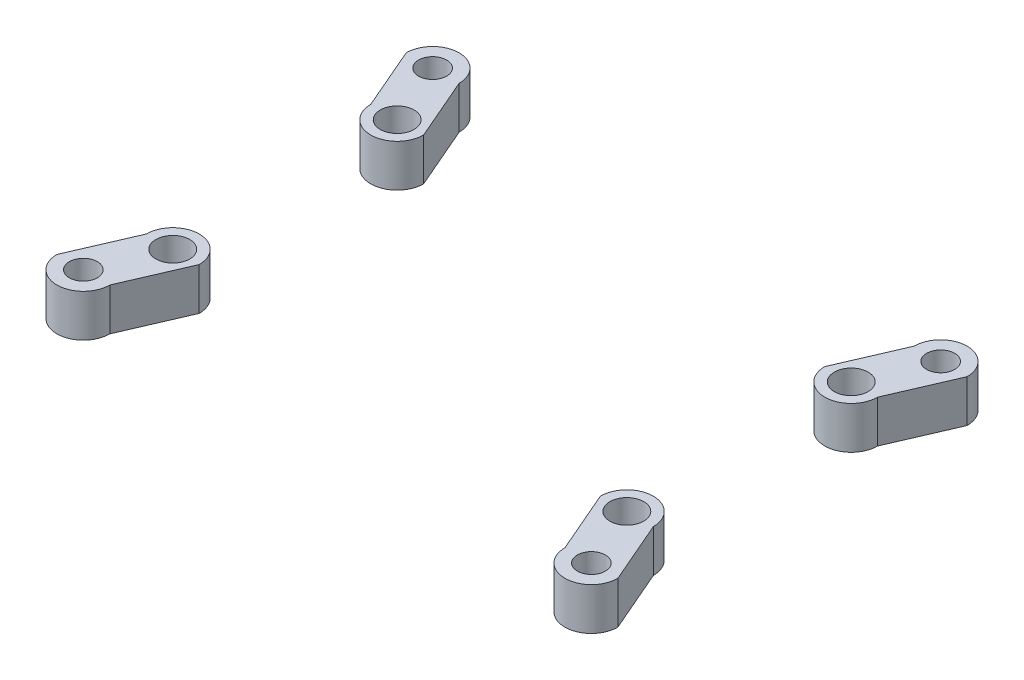
ISO-10303-21;
HEADER;
FILE_DESCRIPTION(('STEP AP214'),'2;1');
FILE_NAME('part.step','',(''),(''),'','','');
FILE_SCHEMA(('AUTOMOTIVE_DESIGN { 1 0 10303 214 1 1 1 1 }'));
ENDSEC;
DATA;
#1=APPLICATION_CONTEXT('core data for automotive mechanical design processes');
#2=APPLICATION_PROTOCOL_DEFINITION('international standard','automotive_design',2000,#1);
#3=PRODUCT_CONTEXT('',#1,'mechanical');
#4=PRODUCT('Part','Part','',(#3));
#5=PRODUCT_RELATED_PRODUCT_CATEGORY('part','',(#4));
#6=PRODUCT_DEFINITION_FORMATION('','',#4);
#7=PRODUCT_DEFINITION_CONTEXT('part definition',#1,'design');
#8=PRODUCT_DEFINITION('design','',#6,#7);
#9=PRODUCT_DEFINITION_SHAPE('','',#8);
#10=(LENGTH_UNIT() NAMED_UNIT(*) SI_UNIT(.MILLI.,.METRE.));
#11=(NAMED_UNIT(*) PLANE_ANGLE_UNIT() SI_UNIT($,.RADIAN.));
#12=(NAMED_UNIT(*) SI_UNIT($,.STERADIAN.) SOLID_ANGLE_UNIT());
#13=UNCERTAINTY_MEASURE_WITH_UNIT(LENGTH_MEASURE(1.E-05),#10,'distance_accuracy_value','');
#14=(GEOMETRIC_REPRESENTATION_CONTEXT(3) GLOBAL_UNCERTAINTY_ASSIGNED_CONTEXT((#13)) GLOBAL_UNIT_ASSIGNED_CONTEXT((#10,
#11,#12)) REPRESENTATION_CONTEXT('',''));
#15=CARTESIAN_POINT('',(0.,0.,0.));
#16=DIRECTION('',(0.,0.,1.));
#17=DIRECTION('',(1.,0.,0.));
#18=AXIS2_PLACEMENT_3D('',#15,#16,#17);
#19=CARTESIAN_POINT('',(-21.45,4.,10.6));
#20=DIRECTION('',(0.,-1.,0.));
#21=DIRECTION('',(0.,0.,-1.));
#22=AXIS2_PLACEMENT_3D('',#19,#20,#21);
#23=CYLINDRICAL_SURFACE('',#22,2.5);
#24=CARTESIAN_POINT('',(-21.45,0.,10.6));
#25=DIRECTION('',(0.,1.,0.));
#26=DIRECTION('',(0.,0.,-1.));
#27=AXIS2_PLACEMENT_3D('',#24,#25,#26);
#28=CIRCLE('',#27,2.5);
#29=CARTESIAN_POINT('',(-18.95,0.,10.6));
#30=VERTEX_POINT('',#29);
#31=CARTESIAN_POINT('',(-23.95,0.,10.6));
#32=VERTEX_POINT('',#31);
#33=EDGE_CURVE('E12',#30,#32,#28,.T.);
#34=ORIENTED_EDGE('',*,*,#33,.T.);
#35=DIRECTION('',(0.,-1.,0.));
#36=VECTOR('',#35,1.);
#37=CARTESIAN_POINT('',(-23.95,4.,10.6));
#38=LINE('',#37,#36);
#39=CARTESIAN_POINT('',(-23.95,4.,10.6));
#40=VERTEX_POINT('',#39);
#41=EDGE_CURVE('E123',#40,#32,#38,.T.);
#42=ORIENTED_EDGE('',*,*,#41,.F.);
#43=CARTESIAN_POINT('',(-21.45,4.,10.6));
#44=DIRECTION('',(0.,1.,0.));
#45=DIRECTION('',(0.,0.,-1.));
#46=AXIS2_PLACEMENT_3D('',#43,#44,#45);
#47=CIRCLE('',#46,2.5);
#48=CARTESIAN_POINT('',(-18.95,4.,10.6));
#49=VERTEX_POINT('',#48);
#50=EDGE_CURVE('E112',#49,#40,#47,.T.);
#51=ORIENTED_EDGE('',*,*,#50,.F.);
#52=DIRECTION('',(0.,-1.,0.));
#53=VECTOR('',#52,1.);
#54=CARTESIAN_POINT('',(-18.95,4.,10.6));
#55=LINE('',#54,#53);
#56=EDGE_CURVE('E109',#49,#30,#55,.T.);
#57=ORIENTED_EDGE('',*,*,#56,.T.);
#58=EDGE_LOOP('',(#34,#42,#51,#57));
#59=FACE_BOUND('',#58,.T.);
#60=ADVANCED_FACE('F50',(#59),#23,.T.);
#61=CARTESIAN_POINT('',(-26.5,4.,16.5));
#62=DIRECTION('',(0.917933613069608,0.,0.396734019208053));
#63=DIRECTION('',(0.396734019208053,0.,-0.917933613069608));
#64=AXIS2_PLACEMENT_3D('',#61,#62,#63);
#65=PLANE('',#64);
#66=DIRECTION('',(-0.396734019208053,0.,0.917933613069608));
#67=VECTOR('',#66,1.);
#68=CARTESIAN_POINT('',(-26.5,0.,16.5));
#69=LINE('',#68,#67);
#70=CARTESIAN_POINT('',(-26.5,0.,16.5));
#71=VERTEX_POINT('',#70);
#72=EDGE_CURVE('E60',#32,#71,#69,.T.);
#73=ORIENTED_EDGE('',*,*,#72,.T.);
#74=DIRECTION('',(0.,-1.,0.));
#75=VECTOR('',#74,1.);
#76=CARTESIAN_POINT('',(-26.5,4.,16.5));
#77=LINE('',#76,#75);
#78=CARTESIAN_POINT('',(-26.5,4.,16.5));
#79=VERTEX_POINT('',#78);
#80=EDGE_CURVE('E105',#79,#71,#77,.T.);
#81=ORIENTED_EDGE('',*,*,#80,.F.);
#82=DIRECTION('',(-0.396734019208053,0.,0.917933613069608));
#83=VECTOR('',#82,1.);
#84=CARTESIAN_POINT('',(-26.5,4.,16.5));
#85=LINE('',#84,#83);
#86=EDGE_CURVE('E84',#40,#79,#85,.T.);
#87=ORIENTED_EDGE('',*,*,#86,.F.);
#88=ORIENTED_EDGE('',*,*,#41,.T.);
#89=EDGE_LOOP('',(#73,#81,#87,#88));
#90=FACE_BOUND('',#89,.T.);
#91=ADVANCED_FACE('F146',(#90),#65,.F.);
#92=CARTESIAN_POINT('',(-24.,4.,16.5));
#93=DIRECTION('',(0.,-1.,0.));
#94=DIRECTION('',(0.,0.,-1.));
#95=AXIS2_PLACEMENT_3D('',#92,#93,#94);
#96=CYLINDRICAL_SURFACE('',#95,2.5);
#97=CARTESIAN_POINT('',(-24.,0.,16.5));
#98=DIRECTION('',(0.,1.,0.));
#99=DIRECTION('',(0.,0.,-1.));
#100=AXIS2_PLACEMENT_3D('',#97,#98,#99);
#101=CIRCLE('',#100,2.5);
#102=CARTESIAN_POINT('',(-21.5,0.,16.5));
#103=VERTEX_POINT('',#102);
#104=EDGE_CURVE('E100',#71,#103,#101,.T.);
#105=ORIENTED_EDGE('',*,*,#104,.T.);
#106=DIRECTION('',(0.,-1.,0.));
#107=VECTOR('',#106,1.);
#108=CARTESIAN_POINT('',(-21.5,4.,16.5));
#109=LINE('',#108,#107);
#110=CARTESIAN_POINT('',(-21.5,4.,16.5));
#111=VERTEX_POINT('',#110);
#112=EDGE_CURVE('E103',#111,#103,#109,.T.);
#113=ORIENTED_EDGE('',*,*,#112,.F.);
#114=CARTESIAN_POINT('',(-24.,4.,16.5));
#115=DIRECTION('',(0.,1.,0.));
#116=DIRECTION('',(0.,0.,-1.));
#117=AXIS2_PLACEMENT_3D('',#114,#115,#116);
#118=CIRCLE('',#117,2.5);
#119=EDGE_CURVE('E119',#79,#111,#118,.T.);
#120=ORIENTED_EDGE('',*,*,#119,.F.);
#121=ORIENTED_EDGE('',*,*,#80,.T.);
#122=EDGE_LOOP('',(#105,#113,#120,#121));
#123=FACE_BOUND('',#122,.T.);
#124=ADVANCED_FACE('F101',(#123),#96,.T.);
#125=CARTESIAN_POINT('',(-21.5,4.,16.5));
#126=DIRECTION('',(-0.917933613069608,0.,-0.396734019208053));
#127=DIRECTION('',(-0.396734019208053,0.,0.917933613069608));
#128=AXIS2_PLACEMENT_3D('',#125,#126,#127);
#129=PLANE('',#128);
#130=DIRECTION('',(0.396734019208053,0.,-0.917933613069608));
#131=VECTOR('',#130,1.);
#132=CARTESIAN_POINT('',(-21.5,0.,16.5));
#133=LINE('',#132,#131);
#134=EDGE_CURVE('E94',#103,#30,#133,.T.);
#135=ORIENTED_EDGE('',*,*,#134,.T.);
#136=ORIENTED_EDGE('',*,*,#56,.F.);
#137=DIRECTION('',(0.396734019208053,0.,-0.917933613069608));
#138=VECTOR('',#137,1.);
#139=CARTESIAN_POINT('',(-21.5,4.,16.5));
#140=LINE('',#139,#138);
#141=EDGE_CURVE('E108',#111,#49,#140,.T.);
#142=ORIENTED_EDGE('',*,*,#141,.F.);
#143=ORIENTED_EDGE('',*,*,#112,.T.);
#144=EDGE_LOOP('',(#135,#136,#142,#143));
#145=FACE_BOUND('',#144,.T.);
#146=ADVANCED_FACE('F107',(#145),#129,.F.);
#147=CARTESIAN_POINT('',(-21.45,4.,10.6));
#148=DIRECTION('',(0.,-1.,0.));
#149=DIRECTION('',(0.,0.,-1.));
#150=AXIS2_PLACEMENT_3D('',#147,#148,#149);
#151=PLANE('',#150);
#152=CARTESIAN_POINT('',(-21.45,4.,10.6));
#153=DIRECTION('',(0.,1.,0.));
#154=DIRECTION('',(0.,0.,1.));
#155=AXIS2_PLACEMENT_3D('',#152,#153,#154);
#156=CIRCLE('',#155,1.6);
#157=CARTESIAN_POINT('',(-21.45,4.,12.2));
#158=VERTEX_POINT('',#157);
#159=EDGE_CURVE('E133',#158,#158,#156,.T.);
#160=ORIENTED_EDGE('',*,*,#159,.F.);
#161=EDGE_LOOP('',(#160));
#162=FACE_BOUND('',#161,.T.);
#163=CARTESIAN_POINT('',(-24.,4.,16.5));
#164=DIRECTION('',(0.,1.,0.));
#165=DIRECTION('',(0.,0.,-1.));
#166=AXIS2_PLACEMENT_3D('',#163,#164,#165);
#167=CIRCLE('',#166,1.325);
#168=CARTESIAN_POINT('',(-24.,4.,15.175));
#169=VERTEX_POINT('',#168);
#170=EDGE_CURVE('E124',#169,#169,#167,.T.);
#171=ORIENTED_EDGE('',*,*,#170,.F.);
#172=EDGE_LOOP('',(#171));
#173=FACE_BOUND('',#172,.T.);
#174=ORIENTED_EDGE('',*,*,#50,.T.);
#175=ORIENTED_EDGE('',*,*,#86,.T.);
#176=ORIENTED_EDGE('',*,*,#119,.T.);
#177=ORIENTED_EDGE('',*,*,#141,.T.);
#178=EDGE_LOOP('',(#174,#175,#176,#177));
#179=FACE_BOUND('',#178,.T.);
#180=ADVANCED_FACE('F52',(#162,#173,#179),#151,.F.);
#181=CARTESIAN_POINT('',(-21.45,0.,10.6));
#182=DIRECTION('',(0.,-1.,0.));
#183=DIRECTION('',(0.,0.,-1.));
#184=AXIS2_PLACEMENT_3D('',#181,#182,#183);
#185=PLANE('',#184);
#186=CARTESIAN_POINT('',(-21.45,0.,10.6));
#187=DIRECTION('',(0.,-1.,0.));
#188=DIRECTION('',(0.,0.,-1.));
#189=AXIS2_PLACEMENT_3D('',#186,#187,#188);
#190=CIRCLE('',#189,1.6);
#191=CARTESIAN_POINT('',(-21.45,0.,9.));
#192=VERTEX_POINT('',#191);
#193=EDGE_CURVE('E54',#192,#192,#190,.F.);
#194=ORIENTED_EDGE('',*,*,#193,.T.);
#195=EDGE_LOOP('',(#194));
#196=FACE_BOUND('',#195,.T.);
#197=CARTESIAN_POINT('',(-24.,0.,16.5));
#198=DIRECTION('',(0.,-1.,0.));
#199=DIRECTION('',(0.,0.,-1.));
#200=AXIS2_PLACEMENT_3D('',#197,#198,#199);
#201=CIRCLE('',#200,1.325);
#202=CARTESIAN_POINT('',(-24.,0.,15.175));
#203=VERTEX_POINT('',#202);
#204=EDGE_CURVE('E121',#203,#203,#201,.F.);
#205=ORIENTED_EDGE('',*,*,#204,.T.);
#206=EDGE_LOOP('',(#205));
#207=FACE_BOUND('',#206,.T.);
#208=ORIENTED_EDGE('',*,*,#33,.F.);
#209=ORIENTED_EDGE('',*,*,#134,.F.);
#210=ORIENTED_EDGE('',*,*,#104,.F.);
#211=ORIENTED_EDGE('',*,*,#72,.F.);
#212=EDGE_LOOP('',(#208,#209,#210,#211));
#213=FACE_BOUND('',#212,.T.);
#214=ADVANCED_FACE('F111',(#196,#207,#213),#185,.T.);
#215=CARTESIAN_POINT('',(-24.,4.,16.5));
#216=DIRECTION('',(0.,-1.,0.));
#217=DIRECTION('',(0.,0.,-1.));
#218=AXIS2_PLACEMENT_3D('',#215,#216,#217);
#219=CYLINDRICAL_SURFACE('',#218,1.325);
#220=ORIENTED_EDGE('',*,*,#204,.F.);
#221=EDGE_LOOP('',(#220));
#222=FACE_BOUND('',#221,.T.);
#223=ORIENTED_EDGE('',*,*,#170,.T.);
#224=EDGE_LOOP('',(#223));
#225=FACE_BOUND('',#224,.T.);
#226=ADVANCED_FACE('F159',(#222,#225),#219,.F.);
#227=CARTESIAN_POINT('',(-21.45,4.,10.6));
#228=DIRECTION('',(0.,-1.,0.));
#229=DIRECTION('',(0.,0.,-1.));
#230=AXIS2_PLACEMENT_3D('',#227,#228,#229);
#231=CYLINDRICAL_SURFACE('',#230,1.6);
#232=ORIENTED_EDGE('',*,*,#193,.F.);
#233=EDGE_LOOP('',(#232));
#234=FACE_BOUND('',#233,.T.);
#235=ORIENTED_EDGE('',*,*,#159,.T.);
#236=EDGE_LOOP('',(#235));
#237=FACE_BOUND('',#236,.T.);
#238=ADVANCED_FACE('F139',(#234,#237),#231,.F.);
#239=CLOSED_SHELL('',(#60,#91,#124,#146,#180,#214,#226,#238));
#240=MANIFOLD_SOLID_BREP('B2',#239);
#241=CARTESIAN_POINT('',(21.45,4.,-10.6));
#242=DIRECTION('',(0.,-1.,0.));
#243=DIRECTION('',(0.,0.,-1.));
#244=AXIS2_PLACEMENT_3D('',#241,#242,#243);
#245=CYLINDRICAL_SURFACE('',#244,2.5);
#246=CARTESIAN_POINT('',(21.45,0.,-10.6));
#247=DIRECTION('',(0.,1.,0.));
#248=DIRECTION('',(0.,0.,-1.));
#249=AXIS2_PLACEMENT_3D('',#246,#247,#248);
#250=CIRCLE('',#249,2.5);
#251=CARTESIAN_POINT('',(18.95,0.,-10.6));
#252=VERTEX_POINT('',#251);
#253=CARTESIAN_POINT('',(23.95,0.,-10.6));
#254=VERTEX_POINT('',#253);
#255=EDGE_CURVE('E48',#252,#254,#250,.T.);
#256=ORIENTED_EDGE('',*,*,#255,.T.);
#257=DIRECTION('',(0.,-1.,0.));
#258=VECTOR('',#257,1.);
#259=CARTESIAN_POINT('',(23.95,4.,-10.6));
#260=LINE('',#259,#258);
#261=CARTESIAN_POINT('',(23.95,4.,-10.6));
#262=VERTEX_POINT('',#261);
#263=EDGE_CURVE('E299',#262,#254,#260,.T.);
#264=ORIENTED_EDGE('',*,*,#263,.F.);
#265=CARTESIAN_POINT('',(21.45,4.,-10.6));
#266=DIRECTION('',(0.,1.,0.));
#267=DIRECTION('',(0.,0.,-1.));
#268=AXIS2_PLACEMENT_3D('',#265,#266,#267);
#269=CIRCLE('',#268,2.5);
#270=CARTESIAN_POINT('',(18.95,4.,-10.6));
#271=VERTEX_POINT('',#270);
#272=EDGE_CURVE('E288',#271,#262,#269,.T.);
#273=ORIENTED_EDGE('',*,*,#272,.F.);
#274=DIRECTION('',(0.,-1.,0.));
#275=VECTOR('',#274,1.);
#276=CARTESIAN_POINT('',(18.95,4.,-10.6));
#277=LINE('',#276,#275);
#278=EDGE_CURVE('E285',#271,#252,#277,.T.);
#279=ORIENTED_EDGE('',*,*,#278,.T.);
#280=EDGE_LOOP('',(#256,#264,#273,#279));
#281=FACE_BOUND('',#280,.T.);
#282=ADVANCED_FACE('F226',(#281),#245,.T.);
#283=CARTESIAN_POINT('',(26.5,4.,-16.5));
#284=DIRECTION('',(-0.917933613069608,0.,-0.396734019208053));
#285=DIRECTION('',(-0.396734019208053,0.,0.917933613069608));
#286=AXIS2_PLACEMENT_3D('',#283,#284,#285);
#287=PLANE('',#286);
#288=DIRECTION('',(0.396734019208053,0.,-0.917933613069608));
#289=VECTOR('',#288,1.);
#290=CARTESIAN_POINT('',(26.5,0.,-16.5));
#291=LINE('',#290,#289);
#292=CARTESIAN_POINT('',(26.5,0.,-16.5));
#293=VERTEX_POINT('',#292);
#294=EDGE_CURVE('E236',#254,#293,#291,.T.);
#295=ORIENTED_EDGE('',*,*,#294,.T.);
#296=DIRECTION('',(0.,-1.,0.));
#297=VECTOR('',#296,1.);
#298=CARTESIAN_POINT('',(26.5,4.,-16.5));
#299=LINE('',#298,#297);
#300=CARTESIAN_POINT('',(26.5,4.,-16.5));
#301=VERTEX_POINT('',#300);
#302=EDGE_CURVE('E281',#301,#293,#299,.T.);
#303=ORIENTED_EDGE('',*,*,#302,.F.);
#304=DIRECTION('',(0.396734019208053,0.,-0.917933613069608));
#305=VECTOR('',#304,1.);
#306=CARTESIAN_POINT('',(26.5,4.,-16.5));
#307=LINE('',#306,#305);
#308=EDGE_CURVE('E260',#262,#301,#307,.T.);
#309=ORIENTED_EDGE('',*,*,#308,.F.);
#310=ORIENTED_EDGE('',*,*,#263,.T.);
#311=EDGE_LOOP('',(#295,#303,#309,#310));
#312=FACE_BOUND('',#311,.T.);
#313=ADVANCED_FACE('F322',(#312),#287,.F.);
#314=CARTESIAN_POINT('',(24.,4.,-16.5));
#315=DIRECTION('',(0.,-1.,0.));
#316=DIRECTION('',(0.,0.,-1.));
#317=AXIS2_PLACEMENT_3D('',#314,#315,#316);
#318=CYLINDRICAL_SURFACE('',#317,2.5);
#319=CARTESIAN_POINT('',(24.,0.,-16.5));
#320=DIRECTION('',(0.,1.,0.));
#321=DIRECTION('',(0.,0.,-1.));
#322=AXIS2_PLACEMENT_3D('',#319,#320,#321);
#323=CIRCLE('',#322,2.5);
#324=CARTESIAN_POINT('',(21.5,0.,-16.5));
#325=VERTEX_POINT('',#324);
#326=EDGE_CURVE('E276',#293,#325,#323,.T.);
#327=ORIENTED_EDGE('',*,*,#326,.T.);
#328=DIRECTION('',(0.,-1.,0.));
#329=VECTOR('',#328,1.);
#330=CARTESIAN_POINT('',(21.5,4.,-16.5));
#331=LINE('',#330,#329);
#332=CARTESIAN_POINT('',(21.5,4.,-16.5));
#333=VERTEX_POINT('',#332);
#334=EDGE_CURVE('E279',#333,#325,#331,.T.);
#335=ORIENTED_EDGE('',*,*,#334,.F.);
#336=CARTESIAN_POINT('',(24.,4.,-16.5));
#337=DIRECTION('',(0.,1.,0.));
#338=DIRECTION('',(0.,0.,-1.));
#339=AXIS2_PLACEMENT_3D('',#336,#337,#338);
#340=CIRCLE('',#339,2.5);
#341=EDGE_CURVE('E295',#301,#333,#340,.T.);
#342=ORIENTED_EDGE('',*,*,#341,.F.);
#343=ORIENTED_EDGE('',*,*,#302,.T.);
#344=EDGE_LOOP('',(#327,#335,#342,#343));
#345=FACE_BOUND('',#344,.T.);
#346=ADVANCED_FACE('F277',(#345),#318,.T.);
#347=CARTESIAN_POINT('',(21.5,4.,-16.5));
#348=DIRECTION('',(0.917933613069608,0.,0.396734019208053));
#349=DIRECTION('',(0.396734019208053,0.,-0.917933613069608));
#350=AXIS2_PLACEMENT_3D('',#347,#348,#349);
#351=PLANE('',#350);
#352=DIRECTION('',(-0.396734019208053,0.,0.917933613069608));
#353=VECTOR('',#352,1.);
#354=CARTESIAN_POINT('',(21.5,0.,-16.5));
#355=LINE('',#354,#353);
#356=EDGE_CURVE('E270',#325,#252,#355,.T.);
#357=ORIENTED_EDGE('',*,*,#356,.T.);
#358=ORIENTED_EDGE('',*,*,#278,.F.);
#359=DIRECTION('',(-0.396734019208053,0.,0.917933613069608));
#360=VECTOR('',#359,1.);
#361=CARTESIAN_POINT('',(21.5,4.,-16.5));
#362=LINE('',#361,#360);
#363=EDGE_CURVE('E284',#333,#271,#362,.T.);
#364=ORIENTED_EDGE('',*,*,#363,.F.);
#365=ORIENTED_EDGE('',*,*,#334,.T.);
#366=EDGE_LOOP('',(#357,#358,#364,#365));
#367=FACE_BOUND('',#366,.T.);
#368=ADVANCED_FACE('F283',(#367),#351,.F.);
#369=CARTESIAN_POINT('',(21.45,4.,-10.6));
#370=DIRECTION('',(0.,-1.,0.));
#371=DIRECTION('',(0.,0.,-1.));
#372=AXIS2_PLACEMENT_3D('',#369,#370,#371);
#373=PLANE('',#372);
#374=CARTESIAN_POINT('',(21.45,4.,-10.6));
#375=DIRECTION('',(0.,1.,0.));
#376=DIRECTION('',(0.,0.,1.));
#377=AXIS2_PLACEMENT_3D('',#374,#375,#376);
#378=CIRCLE('',#377,1.6);
#379=CARTESIAN_POINT('',(21.45,4.,-9.));
#380=VERTEX_POINT('',#379);
#381=EDGE_CURVE('E309',#380,#380,#378,.T.);
#382=ORIENTED_EDGE('',*,*,#381,.F.);
#383=EDGE_LOOP('',(#382));
#384=FACE_BOUND('',#383,.T.);
#385=CARTESIAN_POINT('',(24.,4.,-16.5));
#386=DIRECTION('',(0.,1.,0.));
#387=DIRECTION('',(0.,0.,-1.));
#388=AXIS2_PLACEMENT_3D('',#385,#386,#387);
#389=CIRCLE('',#388,1.325);
#390=CARTESIAN_POINT('',(24.,4.,-17.825));
#391=VERTEX_POINT('',#390);
#392=EDGE_CURVE('E300',#391,#391,#389,.T.);
#393=ORIENTED_EDGE('',*,*,#392,.F.);
#394=EDGE_LOOP('',(#393));
#395=FACE_BOUND('',#394,.T.);
#396=ORIENTED_EDGE('',*,*,#272,.T.);
#397=ORIENTED_EDGE('',*,*,#308,.T.);
#398=ORIENTED_EDGE('',*,*,#341,.T.);
#399=ORIENTED_EDGE('',*,*,#363,.T.);
#400=EDGE_LOOP('',(#396,#397,#398,#399));
#401=FACE_BOUND('',#400,.T.);
#402=ADVANCED_FACE('F228',(#384,#395,#401),#373,.F.);
#403=CARTESIAN_POINT('',(21.45,0.,-10.6));
#404=DIRECTION('',(0.,-1.,0.));
#405=DIRECTION('',(0.,0.,-1.));
#406=AXIS2_PLACEMENT_3D('',#403,#404,#405);
#407=PLANE('',#406);
#408=CARTESIAN_POINT('',(21.45,0.,-10.6));
#409=DIRECTION('',(0.,-1.,0.));
#410=DIRECTION('',(0.,0.,-1.));
#411=AXIS2_PLACEMENT_3D('',#408,#409,#410);
#412=CIRCLE('',#411,1.6);
#413=CARTESIAN_POINT('',(21.45,0.,-12.2));
#414=VERTEX_POINT('',#413);
#415=EDGE_CURVE('E230',#414,#414,#412,.F.);
#416=ORIENTED_EDGE('',*,*,#415,.T.);
#417=EDGE_LOOP('',(#416));
#418=FACE_BOUND('',#417,.T.);
#419=CARTESIAN_POINT('',(24.,0.,-16.5));
#420=DIRECTION('',(0.,-1.,0.));
#421=DIRECTION('',(0.,0.,-1.));
#422=AXIS2_PLACEMENT_3D('',#419,#420,#421);
#423=CIRCLE('',#422,1.325);
#424=CARTESIAN_POINT('',(24.,0.,-17.825));
#425=VERTEX_POINT('',#424);
#426=EDGE_CURVE('E297',#425,#425,#423,.F.);
#427=ORIENTED_EDGE('',*,*,#426,.T.);
#428=EDGE_LOOP('',(#427));
#429=FACE_BOUND('',#428,.T.);
#430=ORIENTED_EDGE('',*,*,#255,.F.);
#431=ORIENTED_EDGE('',*,*,#356,.F.);
#432=ORIENTED_EDGE('',*,*,#326,.F.);
#433=ORIENTED_EDGE('',*,*,#294,.F.);
#434=EDGE_LOOP('',(#430,#431,#432,#433));
#435=FACE_BOUND('',#434,.T.);
#436=ADVANCED_FACE('F287',(#418,#429,#435),#407,.T.);
#437=CARTESIAN_POINT('',(24.,4.,-16.5));
#438=DIRECTION('',(0.,-1.,0.));
#439=DIRECTION('',(0.,0.,-1.));
#440=AXIS2_PLACEMENT_3D('',#437,#438,#439);
#441=CYLINDRICAL_SURFACE('',#440,1.325);
#442=ORIENTED_EDGE('',*,*,#426,.F.);
#443=EDGE_LOOP('',(#442));
#444=FACE_BOUND('',#443,.T.);
#445=ORIENTED_EDGE('',*,*,#392,.T.);
#446=EDGE_LOOP('',(#445));
#447=FACE_BOUND('',#446,.T.);
#448=ADVANCED_FACE('F335',(#444,#447),#441,.F.);
#449=CARTESIAN_POINT('',(21.45,4.,-10.6));
#450=DIRECTION('',(0.,-1.,0.));
#451=DIRECTION('',(0.,0.,-1.));
#452=AXIS2_PLACEMENT_3D('',#449,#450,#451);
#453=CYLINDRICAL_SURFACE('',#452,1.6);
#454=ORIENTED_EDGE('',*,*,#415,.F.);
#455=EDGE_LOOP('',(#454));
#456=FACE_BOUND('',#455,.T.);
#457=ORIENTED_EDGE('',*,*,#381,.T.);
#458=EDGE_LOOP('',(#457));
#459=FACE_BOUND('',#458,.T.);
#460=ADVANCED_FACE('F315',(#456,#459),#453,.F.);
#461=CLOSED_SHELL('',(#282,#313,#346,#368,#402,#436,#448,#460));
#462=MANIFOLD_SOLID_BREP('B6',#461);
#463=CARTESIAN_POINT('',(24.,4.,16.5));
#464=DIRECTION('',(0.,-1.,0.));
#465=DIRECTION('',(0.,0.,-1.));
#466=AXIS2_PLACEMENT_3D('',#463,#464,#465);
#467=CYLINDRICAL_SURFACE('',#466,2.5);
#468=CARTESIAN_POINT('',(24.,0.,16.5));
#469=DIRECTION('',(0.,1.,0.));
#470=DIRECTION('',(0.,0.,1.));
#471=AXIS2_PLACEMENT_3D('',#468,#469,#470);
#472=CIRCLE('',#471,2.5);
#473=CARTESIAN_POINT('',(21.5,0.,16.5));
#474=VERTEX_POINT('',#473);
#475=CARTESIAN_POINT('',(26.5,0.,16.5));
#476=VERTEX_POINT('',#475);
#477=EDGE_CURVE('E224',#474,#476,#472,.T.);
#478=ORIENTED_EDGE('',*,*,#477,.T.);
#479=DIRECTION('',(0.,-1.,0.));
#480=VECTOR('',#479,1.);
#481=CARTESIAN_POINT('',(26.5,4.,16.5));
#482=LINE('',#481,#480);
#483=CARTESIAN_POINT('',(26.5,4.,16.5));
#484=VERTEX_POINT('',#483);
#485=EDGE_CURVE('E474',#484,#476,#482,.T.);
#486=ORIENTED_EDGE('',*,*,#485,.F.);
#487=CARTESIAN_POINT('',(24.,4.,16.5));
#488=DIRECTION('',(0.,1.,0.));
#489=DIRECTION('',(0.,0.,1.));
#490=AXIS2_PLACEMENT_3D('',#487,#488,#489);
#491=CIRCLE('',#490,2.5);
#492=CARTESIAN_POINT('',(21.5,4.,16.5));
#493=VERTEX_POINT('',#492);
#494=EDGE_CURVE('E463',#493,#484,#491,.T.);
#495=ORIENTED_EDGE('',*,*,#494,.F.);
#496=DIRECTION('',(0.,-1.,0.));
#497=VECTOR('',#496,1.);
#498=CARTESIAN_POINT('',(21.5,4.,16.5));
#499=LINE('',#498,#497);
#500=EDGE_CURVE('E460',#493,#474,#499,.T.);
#501=ORIENTED_EDGE('',*,*,#500,.T.);
#502=EDGE_LOOP('',(#478,#486,#495,#501));
#503=FACE_BOUND('',#502,.T.);
#504=ADVANCED_FACE('F401',(#503),#467,.T.);
#505=CARTESIAN_POINT('',(26.5,4.,16.5));
#506=DIRECTION('',(-0.917933613069608,0.,0.396734019208053));
#507=DIRECTION('',(0.396734019208053,0.,0.917933613069608));
#508=AXIS2_PLACEMENT_3D('',#505,#506,#507);
#509=PLANE('',#508);
#510=DIRECTION('',(-0.396734019208053,0.,-0.917933613069608));
#511=VECTOR('',#510,1.);
#512=CARTESIAN_POINT('',(26.5,0.,16.5));
#513=LINE('',#512,#511);
#514=CARTESIAN_POINT('',(23.95,0.,10.6));
#515=VERTEX_POINT('',#514);
#516=EDGE_CURVE('E411',#476,#515,#513,.T.);
#517=ORIENTED_EDGE('',*,*,#516,.T.);
#518=DIRECTION('',(0.,-1.,0.));
#519=VECTOR('',#518,1.);
#520=CARTESIAN_POINT('',(23.95,4.,10.6));
#521=LINE('',#520,#519);
#522=CARTESIAN_POINT('',(23.95,4.,10.6));
#523=VERTEX_POINT('',#522);
#524=EDGE_CURVE('E456',#523,#515,#521,.T.);
#525=ORIENTED_EDGE('',*,*,#524,.F.);
#526=DIRECTION('',(-0.396734019208053,0.,-0.917933613069608));
#527=VECTOR('',#526,1.);
#528=CARTESIAN_POINT('',(26.5,4.,16.5));
#529=LINE('',#528,#527);
#530=EDGE_CURVE('E435',#484,#523,#529,.T.);
#531=ORIENTED_EDGE('',*,*,#530,.F.);
#532=ORIENTED_EDGE('',*,*,#485,.T.);
#533=EDGE_LOOP('',(#517,#525,#531,#532));
#534=FACE_BOUND('',#533,.T.);
#535=ADVANCED_FACE('F498',(#534),#509,.F.);
#536=CARTESIAN_POINT('',(21.45,4.,10.6));
#537=DIRECTION('',(0.,-1.,0.));
#538=DIRECTION('',(0.,0.,-1.));
#539=AXIS2_PLACEMENT_3D('',#536,#537,#538);
#540=CYLINDRICAL_SURFACE('',#539,2.5);
#541=CARTESIAN_POINT('',(21.45,0.,10.6));
#542=DIRECTION('',(0.,1.,0.));
#543=DIRECTION('',(0.,0.,1.));
#544=AXIS2_PLACEMENT_3D('',#541,#542,#543);
#545=CIRCLE('',#544,2.5);
#546=CARTESIAN_POINT('',(18.95,0.,10.6));
#547=VERTEX_POINT('',#546);
#548=EDGE_CURVE('E451',#515,#547,#545,.T.);
#549=ORIENTED_EDGE('',*,*,#548,.T.);
#550=DIRECTION('',(0.,-1.,0.));
#551=VECTOR('',#550,1.);
#552=CARTESIAN_POINT('',(18.95,4.,10.6));
#553=LINE('',#552,#551);
#554=CARTESIAN_POINT('',(18.95,4.,10.6));
#555=VERTEX_POINT('',#554);
#556=EDGE_CURVE('E454',#555,#547,#553,.T.);
#557=ORIENTED_EDGE('',*,*,#556,.F.);
#558=CARTESIAN_POINT('',(21.45,4.,10.6));
#559=DIRECTION('',(0.,1.,0.));
#560=DIRECTION('',(0.,0.,1.));
#561=AXIS2_PLACEMENT_3D('',#558,#559,#560);
#562=CIRCLE('',#561,2.5);
#563=EDGE_CURVE('E470',#523,#555,#562,.T.);
#564=ORIENTED_EDGE('',*,*,#563,.F.);
#565=ORIENTED_EDGE('',*,*,#524,.T.);
#566=EDGE_LOOP('',(#549,#557,#564,#565));
#567=FACE_BOUND('',#566,.T.);
#568=ADVANCED_FACE('F452',(#567),#540,.T.);
#569=CARTESIAN_POINT('',(21.5,4.,16.5));
#570=DIRECTION('',(0.917933613069608,0.,-0.396734019208053));
#571=DIRECTION('',(-0.396734019208053,0.,-0.917933613069608));
#572=AXIS2_PLACEMENT_3D('',#569,#570,#571);
#573=PLANE('',#572);
#574=DIRECTION('',(0.396734019208053,0.,0.917933613069608));
#575=VECTOR('',#574,1.);
#576=CARTESIAN_POINT('',(21.5,0.,16.5));
#577=LINE('',#576,#575);
#578=EDGE_CURVE('E445',#547,#474,#577,.T.);
#579=ORIENTED_EDGE('',*,*,#578,.T.);
#580=ORIENTED_EDGE('',*,*,#500,.F.);
#581=DIRECTION('',(0.396734019208053,0.,0.917933613069608));
#582=VECTOR('',#581,1.);
#583=CARTESIAN_POINT('',(21.5,4.,16.5));
#584=LINE('',#583,#582);
#585=EDGE_CURVE('E459',#555,#493,#584,.T.);
#586=ORIENTED_EDGE('',*,*,#585,.F.);
#587=ORIENTED_EDGE('',*,*,#556,.T.);
#588=EDGE_LOOP('',(#579,#580,#586,#587));
#589=FACE_BOUND('',#588,.T.);
#590=ADVANCED_FACE('F458',(#589),#573,.F.);
#591=CARTESIAN_POINT('',(24.,4.,16.5));
#592=DIRECTION('',(0.,1.,0.));
#593=DIRECTION('',(0.,0.,1.));
#594=AXIS2_PLACEMENT_3D('',#591,#592,#593);
#595=PLANE('',#594);
#596=CARTESIAN_POINT('',(21.45,4.,10.6));
#597=DIRECTION('',(0.,1.,0.));
#598=DIRECTION('',(0.,0.,1.));
#599=AXIS2_PLACEMENT_3D('',#596,#597,#598);
#600=CIRCLE('',#599,1.6);
#601=CARTESIAN_POINT('',(21.45,4.,12.2));
#602=VERTEX_POINT('',#601);
#603=EDGE_CURVE('E484',#602,#602,#600,.T.);
#604=ORIENTED_EDGE('',*,*,#603,.F.);
#605=EDGE_LOOP('',(#604));
#606=FACE_BOUND('',#605,.T.);
#607=CARTESIAN_POINT('',(24.,4.,16.5));
#608=DIRECTION('',(0.,1.,0.));
#609=DIRECTION('',(0.,0.,1.));
#610=AXIS2_PLACEMENT_3D('',#607,#608,#609);
#611=CIRCLE('',#610,1.325);
#612=CARTESIAN_POINT('',(24.,4.,17.825));
#613=VERTEX_POINT('',#612);
#614=EDGE_CURVE('E475',#613,#613,#611,.T.);
#615=ORIENTED_EDGE('',*,*,#614,.F.);
#616=EDGE_LOOP('',(#615));
#617=FACE_BOUND('',#616,.T.);
#618=ORIENTED_EDGE('',*,*,#494,.T.);
#619=ORIENTED_EDGE('',*,*,#530,.T.);
#620=ORIENTED_EDGE('',*,*,#563,.T.);
#621=ORIENTED_EDGE('',*,*,#585,.T.);
#622=EDGE_LOOP('',(#618,#619,#620,#621));
#623=FACE_BOUND('',#622,.T.);
#624=ADVANCED_FACE('F403',(#606,#617,#623),#595,.T.);
#625=CARTESIAN_POINT('',(24.,0.,16.5));
#626=DIRECTION('',(0.,1.,0.));
#627=DIRECTION('',(0.,0.,1.));
#628=AXIS2_PLACEMENT_3D('',#625,#626,#627);
#629=PLANE('',#628);
#630=CARTESIAN_POINT('',(21.45,0.,10.6));
#631=DIRECTION('',(0.,1.,0.));
#632=DIRECTION('',(0.,0.,1.));
#633=AXIS2_PLACEMENT_3D('',#630,#631,#632);
#634=CIRCLE('',#633,1.6);
#635=CARTESIAN_POINT('',(21.45,0.,12.2));
#636=VERTEX_POINT('',#635);
#637=EDGE_CURVE('E405',#636,#636,#634,.F.);
#638=ORIENTED_EDGE('',*,*,#637,.F.);
#639=EDGE_LOOP('',(#638));
#640=FACE_BOUND('',#639,.T.);
#641=CARTESIAN_POINT('',(24.,0.,16.5));
#642=DIRECTION('',(0.,1.,0.));
#643=DIRECTION('',(0.,0.,1.));
#644=AXIS2_PLACEMENT_3D('',#641,#642,#643);
#645=CIRCLE('',#644,1.325);
#646=CARTESIAN_POINT('',(24.,0.,17.825));
#647=VERTEX_POINT('',#646);
#648=EDGE_CURVE('E472',#647,#647,#645,.F.);
#649=ORIENTED_EDGE('',*,*,#648,.F.);
#650=EDGE_LOOP('',(#649));
#651=FACE_BOUND('',#650,.T.);
#652=ORIENTED_EDGE('',*,*,#477,.F.);
#653=ORIENTED_EDGE('',*,*,#578,.F.);
#654=ORIENTED_EDGE('',*,*,#548,.F.);
#655=ORIENTED_EDGE('',*,*,#516,.F.);
#656=EDGE_LOOP('',(#652,#653,#654,#655));
#657=FACE_BOUND('',#656,.T.);
#658=ADVANCED_FACE('F462',(#640,#651,#657),#629,.F.);
#659=CARTESIAN_POINT('',(24.,4.,16.5));
#660=DIRECTION('',(0.,-1.,0.));
#661=DIRECTION('',(0.,0.,-1.));
#662=AXIS2_PLACEMENT_3D('',#659,#660,#661);
#663=CYLINDRICAL_SURFACE('',#662,1.325);
#664=ORIENTED_EDGE('',*,*,#614,.T.);
#665=EDGE_LOOP('',(#664));
#666=FACE_BOUND('',#665,.T.);
#667=ORIENTED_EDGE('',*,*,#648,.T.);
#668=EDGE_LOOP('',(#667));
#669=FACE_BOUND('',#668,.T.);
#670=ADVANCED_FACE('F511',(#666,#669),#663,.F.);
#671=CARTESIAN_POINT('',(21.45,4.,10.6));
#672=DIRECTION('',(0.,-1.,0.));
#673=DIRECTION('',(0.,0.,-1.));
#674=AXIS2_PLACEMENT_3D('',#671,#672,#673);
#675=CYLINDRICAL_SURFACE('',#674,1.6);
#676=ORIENTED_EDGE('',*,*,#603,.T.);
#677=EDGE_LOOP('',(#676));
#678=FACE_BOUND('',#677,.T.);
#679=ORIENTED_EDGE('',*,*,#637,.T.);
#680=EDGE_LOOP('',(#679));
#681=FACE_BOUND('',#680,.T.);
#682=ADVANCED_FACE('F490',(#678,#681),#675,.F.);
#683=CLOSED_SHELL('',(#504,#535,#568,#590,#624,#658,#670,#682));
#684=MANIFOLD_SOLID_BREP('B42',#683);
#685=CARTESIAN_POINT('',(-24.,4.,-16.5));
#686=DIRECTION('',(0.,-1.,0.));
#687=DIRECTION('',(0.,0.,-1.));
#688=AXIS2_PLACEMENT_3D('',#685,#686,#687);
#689=CYLINDRICAL_SURFACE('',#688,2.5);
#690=CARTESIAN_POINT('',(-24.,0.,-16.5));
#691=DIRECTION('',(0.,1.,0.));
#692=DIRECTION('',(0.,0.,1.));
#693=AXIS2_PLACEMENT_3D('',#690,#691,#692);
#694=CIRCLE('',#693,2.5);
#695=CARTESIAN_POINT('',(-21.5,0.,-16.5));
#696=VERTEX_POINT('',#695);
#697=CARTESIAN_POINT('',(-26.5,0.,-16.5));
#698=VERTEX_POINT('',#697);
#699=EDGE_CURVE('E633',#696,#698,#694,.T.);
#700=ORIENTED_EDGE('',*,*,#699,.T.);
#701=DIRECTION('',(0.,-1.,0.));
#702=VECTOR('',#701,1.);
#703=CARTESIAN_POINT('',(-26.5,4.,-16.5));
#704=LINE('',#703,#702);
#705=CARTESIAN_POINT('',(-26.5,4.,-16.5));
#706=VERTEX_POINT('',#705);
#707=EDGE_CURVE('E399',#706,#698,#704,.T.);
#708=ORIENTED_EDGE('',*,*,#707,.F.);
#709=CARTESIAN_POINT('',(-24.,4.,-16.5));
#710=DIRECTION('',(0.,1.,0.));
#711=DIRECTION('',(0.,0.,1.));
#712=AXIS2_PLACEMENT_3D('',#709,#710,#711);
#713=CIRCLE('',#712,2.5);
#714=CARTESIAN_POINT('',(-21.5,4.,-16.5));
#715=VERTEX_POINT('',#714);
#716=EDGE_CURVE('E620',#715,#706,#713,.T.);
#717=ORIENTED_EDGE('',*,*,#716,.F.);
#718=DIRECTION('',(0.,-1.,0.));
#719=VECTOR('',#718,1.);
#720=CARTESIAN_POINT('',(-21.5,4.,-16.5));
#721=LINE('',#720,#719);
#722=EDGE_CURVE('E629',#715,#696,#721,.T.);
#723=ORIENTED_EDGE('',*,*,#722,.T.);
#724=EDGE_LOOP('',(#700,#708,#717,#723));
#725=FACE_BOUND('',#724,.T.);
#726=ADVANCED_FACE('F567',(#725),#689,.T.);
#727=CARTESIAN_POINT('',(-26.5,4.,-16.5));
#728=DIRECTION('',(0.917933613069608,0.,-0.396734019208053));
#729=DIRECTION('',(-0.396734019208053,0.,-0.917933613069608));
#730=AXIS2_PLACEMENT_3D('',#727,#728,#729);
#731=PLANE('',#730);
#732=DIRECTION('',(0.396734019208053,0.,0.917933613069608));
#733=VECTOR('',#732,1.);
#734=CARTESIAN_POINT('',(-26.5,0.,-16.5));
#735=LINE('',#734,#733);
#736=CARTESIAN_POINT('',(-23.95,0.,-10.6));
#737=VERTEX_POINT('',#736);
#738=EDGE_CURVE('E624',#698,#737,#735,.T.);
#739=ORIENTED_EDGE('',*,*,#738,.T.);
#740=DIRECTION('',(0.,-1.,0.));
#741=VECTOR('',#740,1.);
#742=CARTESIAN_POINT('',(-23.95,4.,-10.6));
#743=LINE('',#742,#741);
#744=CARTESIAN_POINT('',(-23.95,4.,-10.6));
#745=VERTEX_POINT('',#744);
#746=EDGE_CURVE('E576',#745,#737,#743,.T.);
#747=ORIENTED_EDGE('',*,*,#746,.F.);
#748=DIRECTION('',(0.396734019208053,0.,0.917933613069608));
#749=VECTOR('',#748,1.);
#750=CARTESIAN_POINT('',(-26.5,4.,-16.5));
#751=LINE('',#750,#749);
#752=EDGE_CURVE('E615',#706,#745,#751,.T.);
#753=ORIENTED_EDGE('',*,*,#752,.F.);
#754=ORIENTED_EDGE('',*,*,#707,.T.);
#755=EDGE_LOOP('',(#739,#747,#753,#754));
#756=FACE_BOUND('',#755,.T.);
#757=ADVANCED_FACE('F623',(#756),#731,.F.);
#758=CARTESIAN_POINT('',(-21.45,4.,-10.6));
#759=DIRECTION('',(0.,-1.,0.));
#760=DIRECTION('',(0.,0.,-1.));
#761=AXIS2_PLACEMENT_3D('',#758,#759,#760);
#762=CYLINDRICAL_SURFACE('',#761,2.5);
#763=CARTESIAN_POINT('',(-21.45,0.,-10.6));
#764=DIRECTION('',(0.,1.,0.));
#765=DIRECTION('',(0.,0.,1.));
#766=AXIS2_PLACEMENT_3D('',#763,#764,#765);
#767=CIRCLE('',#766,2.5);
#768=CARTESIAN_POINT('',(-18.95,0.,-10.6));
#769=VERTEX_POINT('',#768);
#770=EDGE_CURVE('E602',#737,#769,#767,.T.);
#771=ORIENTED_EDGE('',*,*,#770,.T.);
#772=DIRECTION('',(0.,-1.,0.));
#773=VECTOR('',#772,1.);
#774=CARTESIAN_POINT('',(-18.95,4.,-10.6));
#775=LINE('',#774,#773);
#776=CARTESIAN_POINT('',(-18.95,4.,-10.6));
#777=VERTEX_POINT('',#776);
#778=EDGE_CURVE('E625',#777,#769,#775,.T.);
#779=ORIENTED_EDGE('',*,*,#778,.F.);
#780=CARTESIAN_POINT('',(-21.45,4.,-10.6));
#781=DIRECTION('',(0.,1.,0.));
#782=DIRECTION('',(0.,0.,1.));
#783=AXIS2_PLACEMENT_3D('',#780,#781,#782);
#784=CIRCLE('',#783,2.5);
#785=EDGE_CURVE('E618',#745,#777,#784,.T.);
#786=ORIENTED_EDGE('',*,*,#785,.F.);
#787=ORIENTED_EDGE('',*,*,#746,.T.);
#788=EDGE_LOOP('',(#771,#779,#786,#787));
#789=FACE_BOUND('',#788,.T.);
#790=ADVANCED_FACE('F627',(#789),#762,.T.);
#791=CARTESIAN_POINT('',(-21.5,4.,-16.5));
#792=DIRECTION('',(-0.917933613069608,0.,0.396734019208053));
#793=DIRECTION('',(0.396734019208053,0.,0.917933613069608));
#794=AXIS2_PLACEMENT_3D('',#791,#792,#793);
#795=PLANE('',#794);
#796=DIRECTION('',(-0.396734019208053,0.,-0.917933613069608));
#797=VECTOR('',#796,1.);
#798=CARTESIAN_POINT('',(-21.5,0.,-16.5));
#799=LINE('',#798,#797);
#800=EDGE_CURVE('E608',#769,#696,#799,.T.);
#801=ORIENTED_EDGE('',*,*,#800,.T.);
#802=ORIENTED_EDGE('',*,*,#722,.F.);
#803=DIRECTION('',(-0.396734019208053,0.,-0.917933613069608));
#804=VECTOR('',#803,1.);
#805=CARTESIAN_POINT('',(-21.5,4.,-16.5));
#806=LINE('',#805,#804);
#807=EDGE_CURVE('E585',#777,#715,#806,.T.);
#808=ORIENTED_EDGE('',*,*,#807,.F.);
#809=ORIENTED_EDGE('',*,*,#778,.T.);
#810=EDGE_LOOP('',(#801,#802,#808,#809));
#811=FACE_BOUND('',#810,.T.);
#812=ADVANCED_FACE('F661',(#811),#795,.F.);
#813=CARTESIAN_POINT('',(-24.,4.,-16.5));
#814=DIRECTION('',(0.,1.,0.));
#815=DIRECTION('',(0.,0.,1.));
#816=AXIS2_PLACEMENT_3D('',#813,#814,#815);
#817=PLANE('',#816);
#818=CARTESIAN_POINT('',(-21.45,4.,-10.6));
#819=DIRECTION('',(0.,1.,0.));
#820=DIRECTION('',(0.,0.,1.));
#821=AXIS2_PLACEMENT_3D('',#818,#819,#820);
#822=CIRCLE('',#821,1.6);
#823=CARTESIAN_POINT('',(-21.45,4.,-9.));
#824=VERTEX_POINT('',#823);
#825=EDGE_CURVE('E650',#824,#824,#822,.T.);
#826=ORIENTED_EDGE('',*,*,#825,.F.);
#827=EDGE_LOOP('',(#826));
#828=FACE_BOUND('',#827,.T.);
#829=CARTESIAN_POINT('',(-24.,4.,-16.5));
#830=DIRECTION('',(0.,1.,0.));
#831=DIRECTION('',(0.,0.,1.));
#832=AXIS2_PLACEMENT_3D('',#829,#830,#831);
#833=CIRCLE('',#832,1.325);
#834=CARTESIAN_POINT('',(-24.,4.,-15.175));
#835=VERTEX_POINT('',#834);
#836=EDGE_CURVE('E642',#835,#835,#833,.T.);
#837=ORIENTED_EDGE('',*,*,#836,.F.);
#838=EDGE_LOOP('',(#837));
#839=FACE_BOUND('',#838,.T.);
#840=ORIENTED_EDGE('',*,*,#716,.T.);
#841=ORIENTED_EDGE('',*,*,#752,.T.);
#842=ORIENTED_EDGE('',*,*,#785,.T.);
#843=ORIENTED_EDGE('',*,*,#807,.T.);
#844=EDGE_LOOP('',(#840,#841,#842,#843));
#845=FACE_BOUND('',#844,.T.);
#846=ADVANCED_FACE('F616',(#828,#839,#845),#817,.T.);
#847=CARTESIAN_POINT('',(-24.,0.,-16.5));
#848=DIRECTION('',(0.,1.,0.));
#849=DIRECTION('',(0.,0.,1.));
#850=AXIS2_PLACEMENT_3D('',#847,#848,#849);
#851=PLANE('',#850);
#852=CARTESIAN_POINT('',(-21.45,0.,-10.6));
#853=DIRECTION('',(0.,1.,0.));
#854=DIRECTION('',(0.,0.,1.));
#855=AXIS2_PLACEMENT_3D('',#852,#853,#854);
#856=CIRCLE('',#855,1.6);
#857=CARTESIAN_POINT('',(-21.45,0.,-9.));
#858=VERTEX_POINT('',#857);
#859=EDGE_CURVE('E570',#858,#858,#856,.F.);
#860=ORIENTED_EDGE('',*,*,#859,.F.);
#861=EDGE_LOOP('',(#860));
#862=FACE_BOUND('',#861,.T.);
#863=CARTESIAN_POINT('',(-24.,0.,-16.5));
#864=DIRECTION('',(0.,1.,0.));
#865=DIRECTION('',(0.,0.,1.));
#866=AXIS2_PLACEMENT_3D('',#863,#864,#865);
#867=CIRCLE('',#866,1.325);
#868=CARTESIAN_POINT('',(-24.,0.,-15.175));
#869=VERTEX_POINT('',#868);
#870=EDGE_CURVE('E636',#869,#869,#867,.F.);
#871=ORIENTED_EDGE('',*,*,#870,.F.);
#872=EDGE_LOOP('',(#871));
#873=FACE_BOUND('',#872,.T.);
#874=ORIENTED_EDGE('',*,*,#699,.F.);
#875=ORIENTED_EDGE('',*,*,#800,.F.);
#876=ORIENTED_EDGE('',*,*,#770,.F.);
#877=ORIENTED_EDGE('',*,*,#738,.F.);
#878=EDGE_LOOP('',(#874,#875,#876,#877));
#879=FACE_BOUND('',#878,.T.);
#880=ADVANCED_FACE('F660',(#862,#873,#879),#851,.F.);
#881=CARTESIAN_POINT('',(-24.,4.,-16.5));
#882=DIRECTION('',(0.,-1.,0.));
#883=DIRECTION('',(0.,0.,-1.));
#884=AXIS2_PLACEMENT_3D('',#881,#882,#883);
#885=CYLINDRICAL_SURFACE('',#884,1.325);
#886=ORIENTED_EDGE('',*,*,#836,.T.);
#887=EDGE_LOOP('',(#886));
#888=FACE_BOUND('',#887,.T.);
#889=ORIENTED_EDGE('',*,*,#870,.T.);
#890=EDGE_LOOP('',(#889));
#891=FACE_BOUND('',#890,.T.);
#892=ADVANCED_FACE('F667',(#888,#891),#885,.F.);
#893=CARTESIAN_POINT('',(-21.45,4.,-10.6));
#894=DIRECTION('',(0.,-1.,0.));
#895=DIRECTION('',(0.,0.,-1.));
#896=AXIS2_PLACEMENT_3D('',#893,#894,#895);
#897=CYLINDRICAL_SURFACE('',#896,1.6);
#898=ORIENTED_EDGE('',*,*,#825,.T.);
#899=EDGE_LOOP('',(#898));
#900=FACE_BOUND('',#899,.T.);
#901=ORIENTED_EDGE('',*,*,#859,.T.);
#902=EDGE_LOOP('',(#901));
#903=FACE_BOUND('',#902,.T.);
#904=ADVANCED_FACE('F655',(#900,#903),#897,.F.);
#905=CLOSED_SHELL('',(#726,#757,#790,#812,#846,#880,#892,#904));
#906=MANIFOLD_SOLID_BREP('B218',#905);
#907=ADVANCED_BREP_SHAPE_REPRESENTATION('',(#18,#240,#462,#684,#906),#14);
#908=SHAPE_DEFINITION_REPRESENTATION(#9,#907);
ENDSEC;
END-ISO-10303-21;
